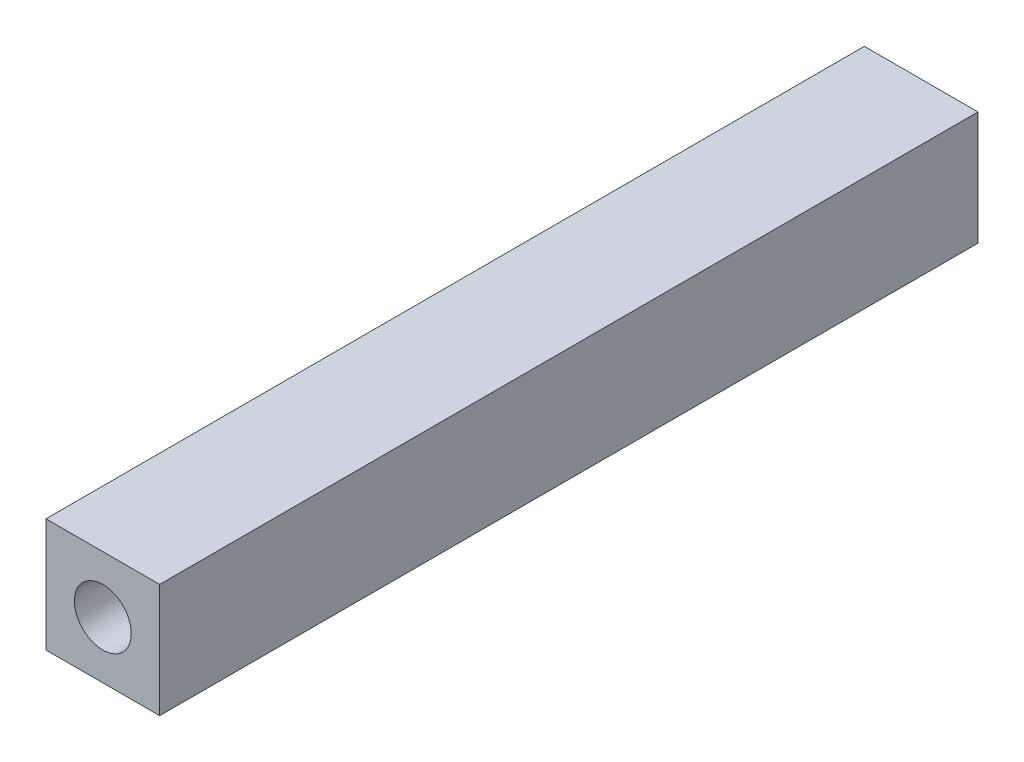
ISO-10303-21;
HEADER;
FILE_DESCRIPTION(('STEP AP214'),'2;1');
FILE_NAME('part.step','',(''),(''),'','','');
FILE_SCHEMA(('AUTOMOTIVE_DESIGN { 1 0 10303 214 1 1 1 1 }'));
ENDSEC;
DATA;
#1=APPLICATION_CONTEXT('core data for automotive mechanical design processes');
#2=APPLICATION_PROTOCOL_DEFINITION('international standard','automotive_design',2000,#1);
#3=PRODUCT_CONTEXT('',#1,'mechanical');
#4=PRODUCT('Part','Part','',(#3));
#5=PRODUCT_RELATED_PRODUCT_CATEGORY('part','',(#4));
#6=PRODUCT_DEFINITION_FORMATION('','',#4);
#7=PRODUCT_DEFINITION_CONTEXT('part definition',#1,'design');
#8=PRODUCT_DEFINITION('design','',#6,#7);
#9=PRODUCT_DEFINITION_SHAPE('','',#8);
#10=(LENGTH_UNIT() NAMED_UNIT(*) SI_UNIT(.MILLI.,.METRE.));
#11=(NAMED_UNIT(*) PLANE_ANGLE_UNIT() SI_UNIT($,.RADIAN.));
#12=(NAMED_UNIT(*) SI_UNIT($,.STERADIAN.) SOLID_ANGLE_UNIT());
#13=UNCERTAINTY_MEASURE_WITH_UNIT(LENGTH_MEASURE(1.E-05),#10,'distance_accuracy_value','');
#14=(GEOMETRIC_REPRESENTATION_CONTEXT(3) GLOBAL_UNCERTAINTY_ASSIGNED_CONTEXT((#13)) GLOBAL_UNIT_ASSIGNED_CONTEXT((#10,
#11,#12)) REPRESENTATION_CONTEXT('',''));
#15=CARTESIAN_POINT('',(0.,0.,0.));
#16=DIRECTION('',(0.,0.,1.));
#17=DIRECTION('',(1.,0.,0.));
#18=AXIS2_PLACEMENT_3D('',#15,#16,#17);
#19=CARTESIAN_POINT('',(0.,-25.,360.));
#20=DIRECTION('',(0.,1.,0.));
#21=DIRECTION('',(0.,0.,1.));
#22=AXIS2_PLACEMENT_3D('',#19,#20,#21);
#23=PLANE('',#22);
#24=DIRECTION('',(1.,0.,0.));
#25=VECTOR('',#24,1.);
#26=CARTESIAN_POINT('',(0.,-25.,0.));
#27=LINE('',#26,#25);
#28=CARTESIAN_POINT('',(-25.,-25.,0.));
#29=VERTEX_POINT('',#28);
#30=CARTESIAN_POINT('',(25.,-25.,0.));
#31=VERTEX_POINT('',#30);
#32=EDGE_CURVE('E106',#29,#31,#27,.T.);
#33=ORIENTED_EDGE('',*,*,#32,.T.);
#34=DIRECTION('',(0.,0.,-1.));
#35=VECTOR('',#34,1.);
#36=CARTESIAN_POINT('',(25.,-25.,360.));
#37=LINE('',#36,#35);
#38=CARTESIAN_POINT('',(25.,-25.,360.));
#39=VERTEX_POINT('',#38);
#40=EDGE_CURVE('E11',#39,#31,#37,.T.);
#41=ORIENTED_EDGE('',*,*,#40,.F.);
#42=DIRECTION('',(1.,0.,0.));
#43=VECTOR('',#42,1.);
#44=CARTESIAN_POINT('',(0.,-25.,360.));
#45=LINE('',#44,#43);
#46=CARTESIAN_POINT('',(-25.,-25.,360.));
#47=VERTEX_POINT('',#46);
#48=EDGE_CURVE('E89',#47,#39,#45,.T.);
#49=ORIENTED_EDGE('',*,*,#48,.F.);
#50=DIRECTION('',(0.,0.,-1.));
#51=VECTOR('',#50,1.);
#52=CARTESIAN_POINT('',(-25.,-25.,360.));
#53=LINE('',#52,#51);
#54=EDGE_CURVE('E55',#47,#29,#53,.T.);
#55=ORIENTED_EDGE('',*,*,#54,.T.);
#56=EDGE_LOOP('',(#33,#41,#49,#55));
#57=FACE_BOUND('',#56,.T.);
#58=ADVANCED_FACE('F39',(#57),#23,.F.);
#59=CARTESIAN_POINT('',(25.,0.,360.));
#60=DIRECTION('',(-1.,0.,0.));
#61=DIRECTION('',(0.,0.,1.));
#62=AXIS2_PLACEMENT_3D('',#59,#60,#61);
#63=PLANE('',#62);
#64=DIRECTION('',(0.,1.,0.));
#65=VECTOR('',#64,1.);
#66=CARTESIAN_POINT('',(25.,0.,0.));
#67=LINE('',#66,#65);
#68=CARTESIAN_POINT('',(25.,25.,0.));
#69=VERTEX_POINT('',#68);
#70=EDGE_CURVE('E94',#31,#69,#67,.T.);
#71=ORIENTED_EDGE('',*,*,#70,.T.);
#72=DIRECTION('',(0.,0.,-1.));
#73=VECTOR('',#72,1.);
#74=CARTESIAN_POINT('',(25.,25.,360.));
#75=LINE('',#74,#73);
#76=CARTESIAN_POINT('',(25.,25.,360.));
#77=VERTEX_POINT('',#76);
#78=EDGE_CURVE('E47',#77,#69,#75,.T.);
#79=ORIENTED_EDGE('',*,*,#78,.F.);
#80=DIRECTION('',(0.,1.,0.));
#81=VECTOR('',#80,1.);
#82=CARTESIAN_POINT('',(25.,0.,360.));
#83=LINE('',#82,#81);
#84=EDGE_CURVE('E80',#39,#77,#83,.T.);
#85=ORIENTED_EDGE('',*,*,#84,.F.);
#86=ORIENTED_EDGE('',*,*,#40,.T.);
#87=EDGE_LOOP('',(#71,#79,#85,#86));
#88=FACE_BOUND('',#87,.T.);
#89=ADVANCED_FACE('F93',(#88),#63,.F.);
#90=CARTESIAN_POINT('',(0.,25.,360.));
#91=DIRECTION('',(0.,1.,0.));
#92=DIRECTION('',(0.,0.,1.));
#93=AXIS2_PLACEMENT_3D('',#90,#91,#92);
#94=PLANE('',#93);
#95=DIRECTION('',(1.,0.,0.));
#96=VECTOR('',#95,1.);
#97=CARTESIAN_POINT('',(0.,25.,0.));
#98=LINE('',#97,#96);
#99=CARTESIAN_POINT('',(-25.,25.,0.));
#100=VERTEX_POINT('',#99);
#101=EDGE_CURVE('E109',#100,#69,#98,.T.);
#102=ORIENTED_EDGE('',*,*,#101,.F.);
#103=DIRECTION('',(0.,0.,-1.));
#104=VECTOR('',#103,1.);
#105=CARTESIAN_POINT('',(-25.,25.,360.));
#106=LINE('',#105,#104);
#107=CARTESIAN_POINT('',(-25.,25.,360.));
#108=VERTEX_POINT('',#107);
#109=EDGE_CURVE('E69',#108,#100,#106,.T.);
#110=ORIENTED_EDGE('',*,*,#109,.F.);
#111=DIRECTION('',(1.,0.,0.));
#112=VECTOR('',#111,1.);
#113=CARTESIAN_POINT('',(0.,25.,360.));
#114=LINE('',#113,#112);
#115=EDGE_CURVE('E88',#108,#77,#114,.T.);
#116=ORIENTED_EDGE('',*,*,#115,.T.);
#117=ORIENTED_EDGE('',*,*,#78,.T.);
#118=EDGE_LOOP('',(#102,#110,#116,#117));
#119=FACE_BOUND('',#118,.T.);
#120=ADVANCED_FACE('F97',(#119),#94,.T.);
#121=CARTESIAN_POINT('',(-25.,0.,360.));
#122=DIRECTION('',(-1.,0.,0.));
#123=DIRECTION('',(0.,0.,1.));
#124=AXIS2_PLACEMENT_3D('',#121,#122,#123);
#125=PLANE('',#124);
#126=DIRECTION('',(0.,1.,0.));
#127=VECTOR('',#126,1.);
#128=CARTESIAN_POINT('',(-25.,0.,0.));
#129=LINE('',#128,#127);
#130=EDGE_CURVE('E111',#29,#100,#129,.T.);
#131=ORIENTED_EDGE('',*,*,#130,.F.);
#132=ORIENTED_EDGE('',*,*,#54,.F.);
#133=DIRECTION('',(0.,1.,0.));
#134=VECTOR('',#133,1.);
#135=CARTESIAN_POINT('',(-25.,0.,360.));
#136=LINE('',#135,#134);
#137=EDGE_CURVE('E98',#47,#108,#136,.T.);
#138=ORIENTED_EDGE('',*,*,#137,.T.);
#139=ORIENTED_EDGE('',*,*,#109,.T.);
#140=EDGE_LOOP('',(#131,#132,#138,#139));
#141=FACE_BOUND('',#140,.T.);
#142=ADVANCED_FACE('F124',(#141),#125,.T.);
#143=CARTESIAN_POINT('',(0.,0.,360.));
#144=DIRECTION('',(0.,0.,-1.));
#145=DIRECTION('',(-1.,0.,0.));
#146=AXIS2_PLACEMENT_3D('',#143,#144,#145);
#147=CYLINDRICAL_SURFACE('',#146,12.5);
#148=CARTESIAN_POINT('',(0.,0.,360.));
#149=DIRECTION('',(0.,0.,1.));
#150=DIRECTION('',(1.,0.,0.));
#151=AXIS2_PLACEMENT_3D('',#148,#149,#150);
#152=CIRCLE('',#151,12.5);
#153=CARTESIAN_POINT('',(12.5,0.,360.));
#154=VERTEX_POINT('',#153);
#155=EDGE_CURVE('E100',#154,#154,#152,.T.);
#156=ORIENTED_EDGE('',*,*,#155,.T.);
#157=EDGE_LOOP('',(#156));
#158=FACE_BOUND('',#157,.T.);
#159=CARTESIAN_POINT('',(0.,0.,0.));
#160=DIRECTION('',(0.,0.,1.));
#161=DIRECTION('',(1.,0.,0.));
#162=AXIS2_PLACEMENT_3D('',#159,#160,#161);
#163=CIRCLE('',#162,12.5);
#164=CARTESIAN_POINT('',(12.5,0.,0.));
#165=VERTEX_POINT('',#164);
#166=EDGE_CURVE('E114',#165,#165,#163,.T.);
#167=ORIENTED_EDGE('',*,*,#166,.F.);
#168=EDGE_LOOP('',(#167));
#169=FACE_BOUND('',#168,.T.);
#170=ADVANCED_FACE('F122',(#158,#169),#147,.F.);
#171=CARTESIAN_POINT('',(0.,0.,360.));
#172=DIRECTION('',(0.,0.,1.));
#173=DIRECTION('',(1.,0.,0.));
#174=AXIS2_PLACEMENT_3D('',#171,#172,#173);
#175=PLANE('',#174);
#176=ORIENTED_EDGE('',*,*,#48,.T.);
#177=ORIENTED_EDGE('',*,*,#84,.T.);
#178=ORIENTED_EDGE('',*,*,#115,.F.);
#179=ORIENTED_EDGE('',*,*,#137,.F.);
#180=EDGE_LOOP('',(#176,#177,#178,#179));
#181=FACE_BOUND('',#180,.T.);
#182=ORIENTED_EDGE('',*,*,#155,.F.);
#183=EDGE_LOOP('',(#182));
#184=FACE_BOUND('',#183,.T.);
#185=ADVANCED_FACE('F84',(#181,#184),#175,.T.);
#186=CARTESIAN_POINT('',(0.,0.,0.));
#187=DIRECTION('',(0.,0.,1.));
#188=DIRECTION('',(1.,0.,0.));
#189=AXIS2_PLACEMENT_3D('',#186,#187,#188);
#190=PLANE('',#189);
#191=ORIENTED_EDGE('',*,*,#32,.F.);
#192=ORIENTED_EDGE('',*,*,#130,.T.);
#193=ORIENTED_EDGE('',*,*,#101,.T.);
#194=ORIENTED_EDGE('',*,*,#70,.F.);
#195=EDGE_LOOP('',(#191,#192,#193,#194));
#196=FACE_BOUND('',#195,.T.);
#197=ORIENTED_EDGE('',*,*,#166,.T.);
#198=EDGE_LOOP('',(#197));
#199=FACE_BOUND('',#198,.T.);
#200=ADVANCED_FACE('F120',(#196,#199),#190,.F.);
#201=CLOSED_SHELL('',(#58,#89,#120,#142,#170,#185,#200));
#202=MANIFOLD_SOLID_BREP('B2',#201);
#203=ADVANCED_BREP_SHAPE_REPRESENTATION('',(#18,#202),#14);
#204=SHAPE_DEFINITION_REPRESENTATION(#9,#203);
ENDSEC;
END-ISO-10303-21;
